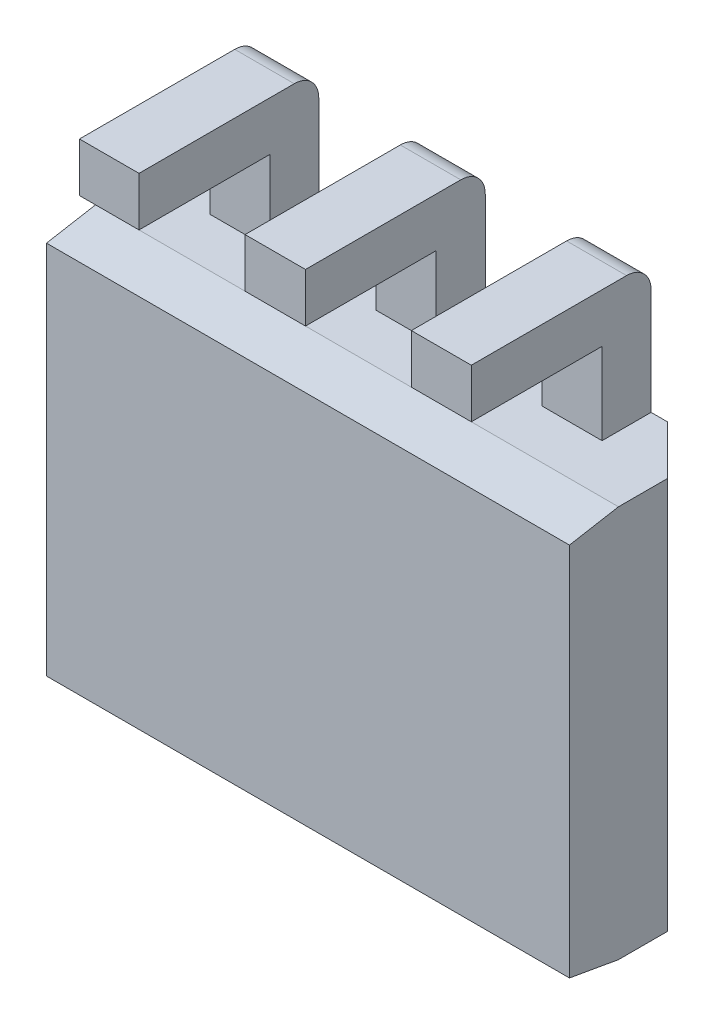
ISO-10303-21;
HEADER;
FILE_DESCRIPTION(('STEP AP214'),'2;1');
FILE_NAME('part.step','',(''),(''),'','','');
FILE_SCHEMA(('AUTOMOTIVE_DESIGN { 1 0 10303 214 1 1 1 1 }'));
ENDSEC;
DATA;
#1=APPLICATION_CONTEXT('core data for automotive mechanical design processes');
#2=APPLICATION_PROTOCOL_DEFINITION('international standard','automotive_design',2000,#1);
#3=PRODUCT_CONTEXT('',#1,'mechanical');
#4=PRODUCT('Part','Part','',(#3));
#5=PRODUCT_RELATED_PRODUCT_CATEGORY('part','',(#4));
#6=PRODUCT_DEFINITION_FORMATION('','',#4);
#7=PRODUCT_DEFINITION_CONTEXT('part definition',#1,'design');
#8=PRODUCT_DEFINITION('design','',#6,#7);
#9=PRODUCT_DEFINITION_SHAPE('','',#8);
#10=(LENGTH_UNIT() NAMED_UNIT(*) SI_UNIT(.MILLI.,.METRE.));
#11=(NAMED_UNIT(*) PLANE_ANGLE_UNIT() SI_UNIT($,.RADIAN.));
#12=(NAMED_UNIT(*) SI_UNIT($,.STERADIAN.) SOLID_ANGLE_UNIT());
#13=UNCERTAINTY_MEASURE_WITH_UNIT(LENGTH_MEASURE(1.E-05),#10,'distance_accuracy_value','');
#14=(GEOMETRIC_REPRESENTATION_CONTEXT(3) GLOBAL_UNCERTAINTY_ASSIGNED_CONTEXT((#13)) GLOBAL_UNIT_ASSIGNED_CONTEXT((#10,
#11,#12)) REPRESENTATION_CONTEXT('',''));
#15=CARTESIAN_POINT('',(0.,0.,0.));
#16=DIRECTION('',(0.,0.,1.));
#17=DIRECTION('',(1.,0.,0.));
#18=AXIS2_PLACEMENT_3D('',#15,#16,#17);
#19=CARTESIAN_POINT('',(-1.0423494314685,2.5,0.));
#20=DIRECTION('',(-1.,0.,0.));
#21=DIRECTION('',(0.,0.,1.));
#22=AXIS2_PLACEMENT_3D('',#19,#20,#21);
#23=PLANE('',#22);
#24=CARTESIAN_POINT('',(-1.0423494314685,2.3125,0.5625));
#25=DIRECTION('',(-1.,0.,0.));
#26=DIRECTION('',(0.,0.,1.));
#27=AXIS2_PLACEMENT_3D('',#24,#25,#26);
#28=CIRCLE('',#27,0.1875);
#29=CARTESIAN_POINT('',(-1.0423494314685,2.5,0.5625));
#30=VERTEX_POINT('',#29);
#31=CARTESIAN_POINT('',(-1.0423494314685,2.3125,0.375));
#32=VERTEX_POINT('',#31);
#33=EDGE_CURVE('E575',#30,#32,#28,.T.);
#34=ORIENTED_EDGE('',*,*,#33,.F.);
#35=DIRECTION('',(0.,0.,-1.));
#36=VECTOR('',#35,1.);
#37=CARTESIAN_POINT('',(-1.0423494314685,2.5,0.));
#38=LINE('',#37,#36);
#39=CARTESIAN_POINT('',(-1.0423494314685,2.5,1.75));
#40=VERTEX_POINT('',#39);
#41=EDGE_CURVE('E300',#40,#30,#38,.T.);
#42=ORIENTED_EDGE('',*,*,#41,.F.);
#43=DIRECTION('',(0.,1.,0.));
#44=VECTOR('',#43,1.);
#45=CARTESIAN_POINT('',(-1.0423494314685,2.5,1.75));
#46=LINE('',#45,#44);
#47=CARTESIAN_POINT('',(-1.0423494314685,2.125,1.75));
#48=VERTEX_POINT('',#47);
#49=EDGE_CURVE('E569',#48,#40,#46,.T.);
#50=ORIENTED_EDGE('',*,*,#49,.F.);
#51=DIRECTION('',(0.,0.,-1.));
#52=VECTOR('',#51,1.);
#53=CARTESIAN_POINT('',(-1.0423494314685,2.125,1.75));
#54=LINE('',#53,#52);
#55=CARTESIAN_POINT('',(-1.0423494314685,2.125,0.75));
#56=VERTEX_POINT('',#55);
#57=EDGE_CURVE('E567',#48,#56,#54,.T.);
#58=ORIENTED_EDGE('',*,*,#57,.T.);
#59=DIRECTION('',(0.,-1.,0.));
#60=VECTOR('',#59,1.);
#61=CARTESIAN_POINT('',(-1.0423494314685,2.5,0.75));
#62=LINE('',#61,#60);
#63=CARTESIAN_POINT('',(-1.0423494314685,1.5,0.75));
#64=VERTEX_POINT('',#63);
#65=EDGE_CURVE('E469',#56,#64,#62,.T.);
#66=ORIENTED_EDGE('',*,*,#65,.T.);
#67=DIRECTION('',(0.,0.,-1.));
#68=VECTOR('',#67,1.);
#69=CARTESIAN_POINT('',(-1.0423494314685,1.5,0.));
#70=LINE('',#69,#68);
#71=CARTESIAN_POINT('',(-1.0423494314685,1.5,0.375));
#72=VERTEX_POINT('',#71);
#73=EDGE_CURVE('E310',#64,#72,#70,.T.);
#74=ORIENTED_EDGE('',*,*,#73,.T.);
#75=DIRECTION('',(0.,-1.,0.));
#76=VECTOR('',#75,1.);
#77=CARTESIAN_POINT('',(-1.0423494314685,2.5,0.375));
#78=LINE('',#77,#76);
#79=EDGE_CURVE('E37',#32,#72,#78,.T.);
#80=ORIENTED_EDGE('',*,*,#79,.F.);
#81=EDGE_LOOP('',(#34,#42,#50,#58,#66,#74,#80));
#82=FACE_BOUND('',#81,.T.);
#83=ADVANCED_FACE('F33',(#82),#23,.F.);
#84=CARTESIAN_POINT('',(-1.49765056853151,2.5,0.));
#85=DIRECTION('',(-1.,0.,0.));
#86=DIRECTION('',(0.,0.,1.));
#87=AXIS2_PLACEMENT_3D('',#84,#85,#86);
#88=PLANE('',#87);
#89=DIRECTION('',(0.,0.,-1.));
#90=VECTOR('',#89,1.);
#91=CARTESIAN_POINT('',(-1.49765056853151,2.5,0.));
#92=LINE('',#91,#90);
#93=CARTESIAN_POINT('',(-1.49765056853151,2.5,1.75));
#94=VERTEX_POINT('',#93);
#95=CARTESIAN_POINT('',(-1.49765056853151,2.5,0.5625));
#96=VERTEX_POINT('',#95);
#97=EDGE_CURVE('E303',#94,#96,#92,.T.);
#98=ORIENTED_EDGE('',*,*,#97,.T.);
#99=CARTESIAN_POINT('',(-1.49765056853151,2.3125,0.5625));
#100=DIRECTION('',(-1.,0.,0.));
#101=DIRECTION('',(0.,0.,1.));
#102=AXIS2_PLACEMENT_3D('',#99,#100,#101);
#103=CIRCLE('',#102,0.1875);
#104=CARTESIAN_POINT('',(-1.49765056853151,2.3125,0.375));
#105=VERTEX_POINT('',#104);
#106=EDGE_CURVE('E51',#96,#105,#103,.T.);
#107=ORIENTED_EDGE('',*,*,#106,.T.);
#108=DIRECTION('',(0.,-1.,0.));
#109=VECTOR('',#108,1.);
#110=CARTESIAN_POINT('',(-1.49765056853151,2.5,0.375));
#111=LINE('',#110,#109);
#112=CARTESIAN_POINT('',(-1.49765056853151,1.5,0.375));
#113=VERTEX_POINT('',#112);
#114=EDGE_CURVE('E335',#105,#113,#111,.T.);
#115=ORIENTED_EDGE('',*,*,#114,.T.);
#116=DIRECTION('',(0.,0.,-1.));
#117=VECTOR('',#116,1.);
#118=CARTESIAN_POINT('',(-1.49765056853151,1.5,0.));
#119=LINE('',#118,#117);
#120=CARTESIAN_POINT('',(-1.49765056853151,1.5,0.75));
#121=VERTEX_POINT('',#120);
#122=EDGE_CURVE('E304',#121,#113,#119,.T.);
#123=ORIENTED_EDGE('',*,*,#122,.F.);
#124=DIRECTION('',(0.,-1.,0.));
#125=VECTOR('',#124,1.);
#126=CARTESIAN_POINT('',(-1.49765056853151,2.5,0.75));
#127=LINE('',#126,#125);
#128=CARTESIAN_POINT('',(-1.49765056853151,2.125,0.75));
#129=VERTEX_POINT('',#128);
#130=EDGE_CURVE('E307',#129,#121,#127,.T.);
#131=ORIENTED_EDGE('',*,*,#130,.F.);
#132=DIRECTION('',(0.,0.,-1.));
#133=VECTOR('',#132,1.);
#134=CARTESIAN_POINT('',(-1.49765056853151,2.125,1.75));
#135=LINE('',#134,#133);
#136=CARTESIAN_POINT('',(-1.49765056853151,2.125,1.75));
#137=VERTEX_POINT('',#136);
#138=EDGE_CURVE('E561',#137,#129,#135,.T.);
#139=ORIENTED_EDGE('',*,*,#138,.F.);
#140=DIRECTION('',(0.,-1.,0.));
#141=VECTOR('',#140,1.);
#142=CARTESIAN_POINT('',(-1.49765056853151,2.5,1.75));
#143=LINE('',#142,#141);
#144=EDGE_CURVE('E559',#94,#137,#143,.T.);
#145=ORIENTED_EDGE('',*,*,#144,.F.);
#146=EDGE_LOOP('',(#98,#107,#115,#123,#131,#139,#145));
#147=FACE_BOUND('',#146,.T.);
#148=ADVANCED_FACE('F491',(#147),#88,.T.);
#149=CARTESIAN_POINT('',(0.231039418599735,2.5,0.));
#150=DIRECTION('',(-1.,0.,0.));
#151=DIRECTION('',(0.,0.,1.));
#152=AXIS2_PLACEMENT_3D('',#149,#150,#151);
#153=PLANE('',#152);
#154=CARTESIAN_POINT('',(0.231039418599735,2.3125,0.5625));
#155=DIRECTION('',(-1.,0.,0.));
#156=DIRECTION('',(0.,0.,1.));
#157=AXIS2_PLACEMENT_3D('',#154,#155,#156);
#158=CIRCLE('',#157,0.1875);
#159=CARTESIAN_POINT('',(0.231039418599735,2.5,0.5625));
#160=VERTEX_POINT('',#159);
#161=CARTESIAN_POINT('',(0.231039418599735,2.3125,0.375));
#162=VERTEX_POINT('',#161);
#163=EDGE_CURVE('E652',#160,#162,#158,.T.);
#164=ORIENTED_EDGE('',*,*,#163,.F.);
#165=DIRECTION('',(0.,0.,-1.));
#166=VECTOR('',#165,1.);
#167=CARTESIAN_POINT('',(0.231039418599735,2.5,0.));
#168=LINE('',#167,#166);
#169=CARTESIAN_POINT('',(0.231039418599735,2.5,1.75));
#170=VERTEX_POINT('',#169);
#171=EDGE_CURVE('E274',#170,#160,#168,.T.);
#172=ORIENTED_EDGE('',*,*,#171,.F.);
#173=DIRECTION('',(0.,1.,0.));
#174=VECTOR('',#173,1.);
#175=CARTESIAN_POINT('',(0.231039418599735,2.5,1.75));
#176=LINE('',#175,#174);
#177=CARTESIAN_POINT('',(0.231039418599735,2.125,1.75));
#178=VERTEX_POINT('',#177);
#179=EDGE_CURVE('E596',#178,#170,#176,.T.);
#180=ORIENTED_EDGE('',*,*,#179,.F.);
#181=DIRECTION('',(0.,0.,-1.));
#182=VECTOR('',#181,1.);
#183=CARTESIAN_POINT('',(0.231039418599735,2.125,1.75));
#184=LINE('',#183,#182);
#185=CARTESIAN_POINT('',(0.231039418599735,2.125,0.75));
#186=VERTEX_POINT('',#185);
#187=EDGE_CURVE('E606',#178,#186,#184,.T.);
#188=ORIENTED_EDGE('',*,*,#187,.T.);
#189=DIRECTION('',(0.,-1.,0.));
#190=VECTOR('',#189,1.);
#191=CARTESIAN_POINT('',(0.231039418599735,2.5,0.75));
#192=LINE('',#191,#190);
#193=CARTESIAN_POINT('',(0.231039418599735,1.5,0.75));
#194=VERTEX_POINT('',#193);
#195=EDGE_CURVE('E297',#186,#194,#192,.T.);
#196=ORIENTED_EDGE('',*,*,#195,.T.);
#197=DIRECTION('',(0.,0.,-1.));
#198=VECTOR('',#197,1.);
#199=CARTESIAN_POINT('',(0.231039418599735,1.5,0.));
#200=LINE('',#199,#198);
#201=CARTESIAN_POINT('',(0.231039418599735,1.5,0.375));
#202=VERTEX_POINT('',#201);
#203=EDGE_CURVE('E284',#194,#202,#200,.T.);
#204=ORIENTED_EDGE('',*,*,#203,.T.);
#205=DIRECTION('',(0.,-1.,0.));
#206=VECTOR('',#205,1.);
#207=CARTESIAN_POINT('',(0.231039418599735,2.5,0.375));
#208=LINE('',#207,#206);
#209=EDGE_CURVE('E295',#162,#202,#208,.T.);
#210=ORIENTED_EDGE('',*,*,#209,.F.);
#211=EDGE_LOOP('',(#164,#172,#180,#188,#196,#204,#210));
#212=FACE_BOUND('',#211,.T.);
#213=ADVANCED_FACE('F496',(#212),#153,.F.);
#214=CARTESIAN_POINT('',(-0.231039418599738,2.5,0.));
#215=DIRECTION('',(-1.,0.,0.));
#216=DIRECTION('',(0.,0.,1.));
#217=AXIS2_PLACEMENT_3D('',#214,#215,#216);
#218=PLANE('',#217);
#219=DIRECTION('',(0.,0.,-1.));
#220=VECTOR('',#219,1.);
#221=CARTESIAN_POINT('',(-0.231039418599738,2.5,0.));
#222=LINE('',#221,#220);
#223=CARTESIAN_POINT('',(-0.231039418599738,2.5,1.75));
#224=VERTEX_POINT('',#223);
#225=CARTESIAN_POINT('',(-0.231039418599738,2.5,0.5625));
#226=VERTEX_POINT('',#225);
#227=EDGE_CURVE('E277',#224,#226,#222,.T.);
#228=ORIENTED_EDGE('',*,*,#227,.T.);
#229=CARTESIAN_POINT('',(-0.231039418599738,2.3125,0.5625));
#230=DIRECTION('',(-1.,0.,0.));
#231=DIRECTION('',(0.,0.,1.));
#232=AXIS2_PLACEMENT_3D('',#229,#230,#231);
#233=CIRCLE('',#232,0.1875);
#234=CARTESIAN_POINT('',(-0.231039418599738,2.3125,0.375));
#235=VERTEX_POINT('',#234);
#236=EDGE_CURVE('E59',#226,#235,#233,.T.);
#237=ORIENTED_EDGE('',*,*,#236,.T.);
#238=DIRECTION('',(0.,-1.,0.));
#239=VECTOR('',#238,1.);
#240=CARTESIAN_POINT('',(-0.231039418599738,2.5,0.375));
#241=LINE('',#240,#239);
#242=CARTESIAN_POINT('',(-0.231039418599738,1.5,0.375));
#243=VERTEX_POINT('',#242);
#244=EDGE_CURVE('E293',#235,#243,#241,.T.);
#245=ORIENTED_EDGE('',*,*,#244,.T.);
#246=DIRECTION('',(0.,0.,-1.));
#247=VECTOR('',#246,1.);
#248=CARTESIAN_POINT('',(-0.231039418599738,1.5,0.));
#249=LINE('',#248,#247);
#250=CARTESIAN_POINT('',(-0.231039418599738,1.5,0.75));
#251=VERTEX_POINT('',#250);
#252=EDGE_CURVE('E278',#251,#243,#249,.T.);
#253=ORIENTED_EDGE('',*,*,#252,.F.);
#254=DIRECTION('',(0.,-1.,0.));
#255=VECTOR('',#254,1.);
#256=CARTESIAN_POINT('',(-0.231039418599738,2.5,0.75));
#257=LINE('',#256,#255);
#258=CARTESIAN_POINT('',(-0.231039418599738,2.125,0.75));
#259=VERTEX_POINT('',#258);
#260=EDGE_CURVE('E281',#259,#251,#257,.T.);
#261=ORIENTED_EDGE('',*,*,#260,.F.);
#262=DIRECTION('',(0.,0.,-1.));
#263=VECTOR('',#262,1.);
#264=CARTESIAN_POINT('',(-0.231039418599738,2.125,1.75));
#265=LINE('',#264,#263);
#266=CARTESIAN_POINT('',(-0.231039418599738,2.125,1.75));
#267=VERTEX_POINT('',#266);
#268=EDGE_CURVE('E610',#267,#259,#265,.T.);
#269=ORIENTED_EDGE('',*,*,#268,.F.);
#270=DIRECTION('',(0.,-1.,0.));
#271=VECTOR('',#270,1.);
#272=CARTESIAN_POINT('',(-0.231039418599738,2.5,1.75));
#273=LINE('',#272,#271);
#274=EDGE_CURVE('E602',#224,#267,#273,.T.);
#275=ORIENTED_EDGE('',*,*,#274,.F.);
#276=EDGE_LOOP('',(#228,#237,#245,#253,#261,#269,#275));
#277=FACE_BOUND('',#276,.T.);
#278=ADVANCED_FACE('F631',(#277),#218,.T.);
#279=CARTESIAN_POINT('',(1.04060488884218,2.5,0.));
#280=DIRECTION('',(1.,0.,0.));
#281=DIRECTION('',(0.,0.,-1.));
#282=AXIS2_PLACEMENT_3D('',#279,#280,#281);
#283=PLANE('',#282);
#284=CARTESIAN_POINT('',(1.04060488884218,2.3125,0.5625));
#285=DIRECTION('',(1.,0.,0.));
#286=DIRECTION('',(0.,0.,-1.));
#287=AXIS2_PLACEMENT_3D('',#284,#285,#286);
#288=CIRCLE('',#287,0.1875);
#289=CARTESIAN_POINT('',(1.04060488884218,2.3125,0.375));
#290=VERTEX_POINT('',#289);
#291=CARTESIAN_POINT('',(1.04060488884218,2.5,0.5625));
#292=VERTEX_POINT('',#291);
#293=EDGE_CURVE('E554',#290,#292,#288,.T.);
#294=ORIENTED_EDGE('',*,*,#293,.F.);
#295=DIRECTION('',(0.,-1.,0.));
#296=VECTOR('',#295,1.);
#297=CARTESIAN_POINT('',(1.04060488884218,2.5,0.375));
#298=LINE('',#297,#296);
#299=CARTESIAN_POINT('',(1.04060488884218,1.5,0.375));
#300=VERTEX_POINT('',#299);
#301=EDGE_CURVE('E253',#290,#300,#298,.T.);
#302=ORIENTED_EDGE('',*,*,#301,.T.);
#303=DIRECTION('',(0.,0.,1.));
#304=VECTOR('',#303,1.);
#305=CARTESIAN_POINT('',(1.04060488884218,1.5,0.));
#306=LINE('',#305,#304);
#307=CARTESIAN_POINT('',(1.04060488884218,1.5,0.75));
#308=VERTEX_POINT('',#307);
#309=EDGE_CURVE('E615',#300,#308,#306,.T.);
#310=ORIENTED_EDGE('',*,*,#309,.T.);
#311=DIRECTION('',(0.,-1.,0.));
#312=VECTOR('',#311,1.);
#313=CARTESIAN_POINT('',(1.04060488884218,2.5,0.75));
#314=LINE('',#313,#312);
#315=CARTESIAN_POINT('',(1.04060488884218,2.125,0.75));
#316=VERTEX_POINT('',#315);
#317=EDGE_CURVE('E264',#316,#308,#314,.T.);
#318=ORIENTED_EDGE('',*,*,#317,.F.);
#319=DIRECTION('',(0.,0.,-1.));
#320=VECTOR('',#319,1.);
#321=CARTESIAN_POINT('',(1.04060488884218,2.125,1.75));
#322=LINE('',#321,#320);
#323=CARTESIAN_POINT('',(1.04060488884218,2.125,1.75));
#324=VERTEX_POINT('',#323);
#325=EDGE_CURVE('E593',#324,#316,#322,.T.);
#326=ORIENTED_EDGE('',*,*,#325,.F.);
#327=DIRECTION('',(0.,-1.,0.));
#328=VECTOR('',#327,1.);
#329=CARTESIAN_POINT('',(1.04060488884218,2.5,1.75));
#330=LINE('',#329,#328);
#331=CARTESIAN_POINT('',(1.04060488884218,2.5,1.75));
#332=VERTEX_POINT('',#331);
#333=EDGE_CURVE('E585',#332,#324,#330,.T.);
#334=ORIENTED_EDGE('',*,*,#333,.F.);
#335=DIRECTION('',(0.,0.,1.));
#336=VECTOR('',#335,1.);
#337=CARTESIAN_POINT('',(1.04060488884218,2.5,0.));
#338=LINE('',#337,#336);
#339=EDGE_CURVE('E266',#292,#332,#338,.T.);
#340=ORIENTED_EDGE('',*,*,#339,.F.);
#341=EDGE_LOOP('',(#294,#302,#310,#318,#326,#334,#340));
#342=FACE_BOUND('',#341,.T.);
#343=ADVANCED_FACE('F695',(#342),#283,.F.);
#344=CARTESIAN_POINT('',(1.49939511115781,2.5,0.));
#345=DIRECTION('',(1.,0.,0.));
#346=DIRECTION('',(0.,0.,-1.));
#347=AXIS2_PLACEMENT_3D('',#344,#345,#346);
#348=PLANE('',#347);
#349=DIRECTION('',(0.,-1.,0.));
#350=VECTOR('',#349,1.);
#351=CARTESIAN_POINT('',(1.49939511115781,2.5,0.375));
#352=LINE('',#351,#350);
#353=CARTESIAN_POINT('',(1.49939511115781,2.3125,0.375));
#354=VERTEX_POINT('',#353);
#355=CARTESIAN_POINT('',(1.49939511115781,1.5,0.375));
#356=VERTEX_POINT('',#355);
#357=EDGE_CURVE('E251',#354,#356,#352,.T.);
#358=ORIENTED_EDGE('',*,*,#357,.F.);
#359=CARTESIAN_POINT('',(1.49939511115781,2.3125,0.5625));
#360=DIRECTION('',(1.,0.,0.));
#361=DIRECTION('',(0.,0.,-1.));
#362=AXIS2_PLACEMENT_3D('',#359,#360,#361);
#363=CIRCLE('',#362,0.1875);
#364=CARTESIAN_POINT('',(1.49939511115781,2.5,0.5625));
#365=VERTEX_POINT('',#364);
#366=EDGE_CURVE('E237',#354,#365,#363,.T.);
#367=ORIENTED_EDGE('',*,*,#366,.T.);
#368=DIRECTION('',(0.,0.,1.));
#369=VECTOR('',#368,1.);
#370=CARTESIAN_POINT('',(1.49939511115781,2.5,0.));
#371=LINE('',#370,#369);
#372=CARTESIAN_POINT('',(1.49939511115781,2.5,1.75));
#373=VERTEX_POINT('',#372);
#374=EDGE_CURVE('E262',#365,#373,#371,.T.);
#375=ORIENTED_EDGE('',*,*,#374,.T.);
#376=DIRECTION('',(0.,1.,0.));
#377=VECTOR('',#376,1.);
#378=CARTESIAN_POINT('',(1.49939511115781,2.5,1.75));
#379=LINE('',#378,#377);
#380=CARTESIAN_POINT('',(1.49939511115781,2.125,1.75));
#381=VERTEX_POINT('',#380);
#382=EDGE_CURVE('E579',#381,#373,#379,.T.);
#383=ORIENTED_EDGE('',*,*,#382,.F.);
#384=DIRECTION('',(0.,0.,-1.));
#385=VECTOR('',#384,1.);
#386=CARTESIAN_POINT('',(1.49939511115781,2.125,1.75));
#387=LINE('',#386,#385);
#388=CARTESIAN_POINT('',(1.49939511115781,2.125,0.75));
#389=VERTEX_POINT('',#388);
#390=EDGE_CURVE('E589',#381,#389,#387,.T.);
#391=ORIENTED_EDGE('',*,*,#390,.T.);
#392=DIRECTION('',(0.,-1.,0.));
#393=VECTOR('',#392,1.);
#394=CARTESIAN_POINT('',(1.49939511115781,2.5,0.75));
#395=LINE('',#394,#393);
#396=CARTESIAN_POINT('',(1.49939511115781,1.5,0.75));
#397=VERTEX_POINT('',#396);
#398=EDGE_CURVE('E261',#389,#397,#395,.T.);
#399=ORIENTED_EDGE('',*,*,#398,.T.);
#400=DIRECTION('',(0.,0.,1.));
#401=VECTOR('',#400,1.);
#402=CARTESIAN_POINT('',(1.49939511115781,1.5,0.));
#403=LINE('',#402,#401);
#404=EDGE_CURVE('E259',#356,#397,#403,.T.);
#405=ORIENTED_EDGE('',*,*,#404,.F.);
#406=EDGE_LOOP('',(#358,#367,#375,#383,#391,#399,#405));
#407=FACE_BOUND('',#406,.T.);
#408=ADVANCED_FACE('F257',(#407),#348,.T.);
#409=CARTESIAN_POINT('',(0.,2.5,0.75));
#410=DIRECTION('',(0.,0.,-1.));
#411=DIRECTION('',(-1.,0.,0.));
#412=AXIS2_PLACEMENT_3D('',#409,#410,#411);
#413=PLANE('',#412);
#414=DIRECTION('',(1.,0.,0.));
#415=VECTOR('',#414,1.);
#416=CARTESIAN_POINT('',(-1.0423494314685,2.125,0.75));
#417=LINE('',#416,#415);
#418=EDGE_CURVE('E573',#129,#56,#417,.T.);
#419=ORIENTED_EDGE('',*,*,#418,.F.);
#420=ORIENTED_EDGE('',*,*,#130,.T.);
#421=DIRECTION('',(1.,0.,0.));
#422=VECTOR('',#421,1.);
#423=CARTESIAN_POINT('',(0.,1.5,0.75));
#424=LINE('',#423,#422);
#425=EDGE_CURVE('E299',#121,#64,#424,.T.);
#426=ORIENTED_EDGE('',*,*,#425,.T.);
#427=ORIENTED_EDGE('',*,*,#65,.F.);
#428=EDGE_LOOP('',(#419,#420,#426,#427));
#429=FACE_BOUND('',#428,.T.);
#430=ADVANCED_FACE('F501',(#429),#413,.F.);
#431=CARTESIAN_POINT('',(0.,2.5,0.75));
#432=DIRECTION('',(0.,0.,-1.));
#433=DIRECTION('',(-1.,0.,0.));
#434=AXIS2_PLACEMENT_3D('',#431,#432,#433);
#435=PLANE('',#434);
#436=DIRECTION('',(1.,0.,0.));
#437=VECTOR('',#436,1.);
#438=CARTESIAN_POINT('',(1.49939511115781,2.125,0.75));
#439=LINE('',#438,#437);
#440=EDGE_CURVE('E578',#316,#389,#439,.T.);
#441=ORIENTED_EDGE('',*,*,#440,.F.);
#442=ORIENTED_EDGE('',*,*,#317,.T.);
#443=DIRECTION('',(1.,0.,0.));
#444=VECTOR('',#443,1.);
#445=CARTESIAN_POINT('',(0.,1.5,0.75));
#446=LINE('',#445,#444);
#447=EDGE_CURVE('E617',#308,#397,#446,.T.);
#448=ORIENTED_EDGE('',*,*,#447,.T.);
#449=ORIENTED_EDGE('',*,*,#398,.F.);
#450=EDGE_LOOP('',(#441,#442,#448,#449));
#451=FACE_BOUND('',#450,.T.);
#452=ADVANCED_FACE('F504',(#451),#435,.F.);
#453=CARTESIAN_POINT('',(0.,2.5,0.75));
#454=DIRECTION('',(0.,0.,-1.));
#455=DIRECTION('',(-1.,0.,0.));
#456=AXIS2_PLACEMENT_3D('',#453,#454,#455);
#457=PLANE('',#456);
#458=DIRECTION('',(1.,0.,0.));
#459=VECTOR('',#458,1.);
#460=CARTESIAN_POINT('',(0.231039418599735,2.125,0.75));
#461=LINE('',#460,#459);
#462=EDGE_CURVE('E595',#259,#186,#461,.T.);
#463=ORIENTED_EDGE('',*,*,#462,.F.);
#464=ORIENTED_EDGE('',*,*,#260,.T.);
#465=DIRECTION('',(1.,0.,0.));
#466=VECTOR('',#465,1.);
#467=CARTESIAN_POINT('',(0.,1.5,0.75));
#468=LINE('',#467,#466);
#469=EDGE_CURVE('E273',#251,#194,#468,.T.);
#470=ORIENTED_EDGE('',*,*,#469,.T.);
#471=ORIENTED_EDGE('',*,*,#195,.F.);
#472=EDGE_LOOP('',(#463,#464,#470,#471));
#473=FACE_BOUND('',#472,.T.);
#474=ADVANCED_FACE('F526',(#473),#457,.F.);
#475=CARTESIAN_POINT('',(-2.,1.5,1.5));
#476=DIRECTION('',(0.,-1.,0.));
#477=DIRECTION('',(0.,0.,-1.));
#478=AXIS2_PLACEMENT_3D('',#475,#476,#477);
#479=PLANE('',#478);
#480=ORIENTED_EDGE('',*,*,#309,.F.);
#481=DIRECTION('',(1.,0.,0.));
#482=VECTOR('',#481,1.);
#483=CARTESIAN_POINT('',(-2.,1.5,0.375));
#484=LINE('',#483,#482);
#485=EDGE_CURVE('E333',#202,#300,#484,.T.);
#486=ORIENTED_EDGE('',*,*,#485,.F.);
#487=ORIENTED_EDGE('',*,*,#203,.F.);
#488=ORIENTED_EDGE('',*,*,#469,.F.);
#489=ORIENTED_EDGE('',*,*,#252,.T.);
#490=EDGE_CURVE('E318',#72,#243,#484,.T.);
#491=ORIENTED_EDGE('',*,*,#490,.F.);
#492=ORIENTED_EDGE('',*,*,#73,.F.);
#493=ORIENTED_EDGE('',*,*,#425,.F.);
#494=ORIENTED_EDGE('',*,*,#122,.T.);
#495=CARTESIAN_POINT('',(-1.625,1.5,0.375));
#496=VERTEX_POINT('',#495);
#497=EDGE_CURVE('E348',#496,#113,#484,.T.);
#498=ORIENTED_EDGE('',*,*,#497,.F.);
#499=DIRECTION('',(0.707106781186546,0.,-0.707106781186549));
#500=VECTOR('',#499,1.);
#501=CARTESIAN_POINT('',(-0.625000000000005,1.5,-0.625000000000002));
#502=LINE('',#501,#500);
#503=CARTESIAN_POINT('',(-2.,1.5,0.75));
#504=VERTEX_POINT('',#503);
#505=EDGE_CURVE('E375',#504,#496,#502,.T.);
#506=ORIENTED_EDGE('',*,*,#505,.F.);
#507=DIRECTION('',(0.,0.,-1.));
#508=VECTOR('',#507,1.);
#509=CARTESIAN_POINT('',(-2.,1.5,1.5));
#510=LINE('',#509,#508);
#511=CARTESIAN_POINT('',(-2.,1.5,1.125));
#512=VERTEX_POINT('',#511);
#513=EDGE_CURVE('E356',#512,#504,#510,.T.);
#514=ORIENTED_EDGE('',*,*,#513,.F.);
#515=DIRECTION('',(1.,0.,0.));
#516=VECTOR('',#515,1.);
#517=CARTESIAN_POINT('',(-2.,1.5,1.125));
#518=LINE('',#517,#516);
#519=CARTESIAN_POINT('',(2.,1.5,1.125));
#520=VERTEX_POINT('',#519);
#521=EDGE_CURVE('E433',#512,#520,#518,.T.);
#522=ORIENTED_EDGE('',*,*,#521,.T.);
#523=DIRECTION('',(0.,0.,-1.));
#524=VECTOR('',#523,1.);
#525=CARTESIAN_POINT('',(2.,1.5,1.5));
#526=LINE('',#525,#524);
#527=CARTESIAN_POINT('',(2.,1.5,0.75));
#528=VERTEX_POINT('',#527);
#529=EDGE_CURVE('E362',#520,#528,#526,.T.);
#530=ORIENTED_EDGE('',*,*,#529,.T.);
#531=DIRECTION('',(-0.707106781186551,0.,-0.707106781186544));
#532=VECTOR('',#531,1.);
#533=CARTESIAN_POINT('',(0.624999999999989,1.5,-0.624999999999996));
#534=LINE('',#533,#532);
#535=CARTESIAN_POINT('',(1.625,1.5,0.375000000000001));
#536=VERTEX_POINT('',#535);
#537=EDGE_CURVE('E386',#528,#536,#534,.T.);
#538=ORIENTED_EDGE('',*,*,#537,.T.);
#539=EDGE_CURVE('E336',#356,#536,#484,.T.);
#540=ORIENTED_EDGE('',*,*,#539,.F.);
#541=ORIENTED_EDGE('',*,*,#404,.T.);
#542=ORIENTED_EDGE('',*,*,#447,.F.);
#543=EDGE_LOOP('',(#480,#486,#487,#488,#489,#491,#492,#493,#494,#498,#506,#514,#522,#530,#538,
#540,#541,#542));
#544=FACE_BOUND('',#543,.T.);
#545=ADVANCED_FACE('F35',(#544),#479,.F.);
#546=CARTESIAN_POINT('',(2.,1.5,1.5));
#547=DIRECTION('',(-1.,0.,0.));
#548=DIRECTION('',(0.,0.,1.));
#549=AXIS2_PLACEMENT_3D('',#546,#547,#548);
#550=PLANE('',#549);
#551=DIRECTION('',(0.,-0.173648177666924,0.984807753012209));
#552=VECTOR('',#551,1.);
#553=CARTESIAN_POINT('',(2.,1.64715579621012,0.290438008302167));
#554=LINE('',#553,#552);
#555=CARTESIAN_POINT('',(2.,1.43387738223433,1.5));
#556=VERTEX_POINT('',#555);
#557=EDGE_CURVE('E438',#520,#556,#554,.T.);
#558=ORIENTED_EDGE('',*,*,#557,.T.);
#559=DIRECTION('',(0.,1.,0.));
#560=VECTOR('',#559,1.);
#561=CARTESIAN_POINT('',(2.,1.5,1.5));
#562=LINE('',#561,#560);
#563=CARTESIAN_POINT('',(2.,-1.43387738223432,1.5));
#564=VERTEX_POINT('',#563);
#565=EDGE_CURVE('E364',#564,#556,#562,.T.);
#566=ORIENTED_EDGE('',*,*,#565,.F.);
#567=DIRECTION('',(0.,0.173648177666931,0.984807753012208));
#568=VECTOR('',#567,1.);
#569=CARTESIAN_POINT('',(2.,-1.64715579621012,0.290438008302179));
#570=LINE('',#569,#568);
#571=CARTESIAN_POINT('',(2.,-1.5,1.12499999999999));
#572=VERTEX_POINT('',#571);
#573=EDGE_CURVE('E440',#572,#564,#570,.T.);
#574=ORIENTED_EDGE('',*,*,#573,.F.);
#575=DIRECTION('',(0.,0.,-1.));
#576=VECTOR('',#575,1.);
#577=CARTESIAN_POINT('',(2.,-1.5,1.5));
#578=LINE('',#577,#576);
#579=CARTESIAN_POINT('',(2.,-1.5,0.75));
#580=VERTEX_POINT('',#579);
#581=EDGE_CURVE('E360',#572,#580,#578,.T.);
#582=ORIENTED_EDGE('',*,*,#581,.T.);
#583=DIRECTION('',(0.,1.,0.));
#584=VECTOR('',#583,1.);
#585=CARTESIAN_POINT('',(2.,-1.5,0.75));
#586=LINE('',#585,#584);
#587=EDGE_CURVE('E381',#580,#528,#586,.T.);
#588=ORIENTED_EDGE('',*,*,#587,.T.);
#589=ORIENTED_EDGE('',*,*,#529,.F.);
#590=EDGE_LOOP('',(#558,#566,#574,#582,#588,#589));
#591=FACE_BOUND('',#590,.T.);
#592=ADVANCED_FACE('F436',(#591),#550,.F.);
#593=CARTESIAN_POINT('',(-2.,1.5,1.5));
#594=DIRECTION('',(1.,0.,0.));
#595=DIRECTION('',(0.,0.,-1.));
#596=AXIS2_PLACEMENT_3D('',#593,#594,#595);
#597=PLANE('',#596);
#598=DIRECTION('',(0.,-0.173648177666924,0.984807753012209));
#599=VECTOR('',#598,1.);
#600=CARTESIAN_POINT('',(-2.,1.64715579621012,0.290438008302167));
#601=LINE('',#600,#599);
#602=CARTESIAN_POINT('',(-2.,1.43387738223433,1.5));
#603=VERTEX_POINT('',#602);
#604=EDGE_CURVE('E473',#512,#603,#601,.T.);
#605=ORIENTED_EDGE('',*,*,#604,.F.);
#606=ORIENTED_EDGE('',*,*,#513,.T.);
#607=DIRECTION('',(0.,1.,0.));
#608=VECTOR('',#607,1.);
#609=CARTESIAN_POINT('',(-2.,-1.5,0.75));
#610=LINE('',#609,#608);
#611=CARTESIAN_POINT('',(-2.,-1.5,0.75));
#612=VERTEX_POINT('',#611);
#613=EDGE_CURVE('E370',#612,#504,#610,.T.);
#614=ORIENTED_EDGE('',*,*,#613,.F.);
#615=DIRECTION('',(0.,0.,-1.));
#616=VECTOR('',#615,1.);
#617=CARTESIAN_POINT('',(-2.,-1.5,1.5));
#618=LINE('',#617,#616);
#619=CARTESIAN_POINT('',(-2.,-1.5,1.12499999999999));
#620=VERTEX_POINT('',#619);
#621=EDGE_CURVE('E358',#620,#612,#618,.T.);
#622=ORIENTED_EDGE('',*,*,#621,.F.);
#623=DIRECTION('',(0.,0.173648177666931,0.984807753012208));
#624=VECTOR('',#623,1.);
#625=CARTESIAN_POINT('',(-2.,-1.64715579621012,0.290438008302179));
#626=LINE('',#625,#624);
#627=CARTESIAN_POINT('',(-2.,-1.43387738223432,1.5));
#628=VERTEX_POINT('',#627);
#629=EDGE_CURVE('E443',#620,#628,#626,.T.);
#630=ORIENTED_EDGE('',*,*,#629,.T.);
#631=DIRECTION('',(0.,-1.,0.));
#632=VECTOR('',#631,1.);
#633=CARTESIAN_POINT('',(-2.,1.5,1.5));
#634=LINE('',#633,#632);
#635=EDGE_CURVE('E367',#603,#628,#634,.T.);
#636=ORIENTED_EDGE('',*,*,#635,.F.);
#637=EDGE_LOOP('',(#605,#606,#614,#622,#630,#636));
#638=FACE_BOUND('',#637,.T.);
#639=ADVANCED_FACE('F455',(#638),#597,.F.);
#640=CARTESIAN_POINT('',(0.,0.,1.5));
#641=DIRECTION('',(0.,0.,-1.));
#642=DIRECTION('',(-1.,0.,0.));
#643=AXIS2_PLACEMENT_3D('',#640,#641,#642);
#644=PLANE('',#643);
#645=DIRECTION('',(1.,0.,0.));
#646=VECTOR('',#645,1.);
#647=CARTESIAN_POINT('',(-2.,1.43387738223433,1.5));
#648=LINE('',#647,#646);
#649=EDGE_CURVE('E444',#603,#556,#648,.T.);
#650=ORIENTED_EDGE('',*,*,#649,.F.);
#651=ORIENTED_EDGE('',*,*,#635,.T.);
#652=DIRECTION('',(1.,0.,0.));
#653=VECTOR('',#652,1.);
#654=CARTESIAN_POINT('',(-2.,-1.43387738223432,1.5));
#655=LINE('',#654,#653);
#656=EDGE_CURVE('E405',#628,#564,#655,.T.);
#657=ORIENTED_EDGE('',*,*,#656,.T.);
#658=ORIENTED_EDGE('',*,*,#565,.T.);
#659=EDGE_LOOP('',(#650,#651,#657,#658));
#660=FACE_BOUND('',#659,.T.);
#661=ADVANCED_FACE('F480',(#660),#644,.F.);
#662=CARTESIAN_POINT('',(-2.,-1.5,1.5));
#663=DIRECTION('',(0.,1.,0.));
#664=DIRECTION('',(0.,0.,1.));
#665=AXIS2_PLACEMENT_3D('',#662,#663,#664);
#666=PLANE('',#665);
#667=ORIENTED_EDGE('',*,*,#581,.F.);
#668=DIRECTION('',(1.,0.,0.));
#669=VECTOR('',#668,1.);
#670=CARTESIAN_POINT('',(-2.,-1.5,1.12499999999999));
#671=LINE('',#670,#669);
#672=EDGE_CURVE('E409',#620,#572,#671,.T.);
#673=ORIENTED_EDGE('',*,*,#672,.F.);
#674=ORIENTED_EDGE('',*,*,#621,.T.);
#675=DIRECTION('',(0.707106781186546,0.,-0.707106781186549));
#676=VECTOR('',#675,1.);
#677=CARTESIAN_POINT('',(-0.625000000000005,-1.5,-0.625000000000002));
#678=LINE('',#677,#676);
#679=CARTESIAN_POINT('',(-1.625,-1.5,0.375000000000002));
#680=VERTEX_POINT('',#679);
#681=EDGE_CURVE('E373',#612,#680,#678,.T.);
#682=ORIENTED_EDGE('',*,*,#681,.T.);
#683=DIRECTION('',(1.,0.,0.));
#684=VECTOR('',#683,1.);
#685=CARTESIAN_POINT('',(-2.,-1.5,0.375000000000002));
#686=LINE('',#685,#684);
#687=CARTESIAN_POINT('',(1.625,-1.5,0.375000000000002));
#688=VERTEX_POINT('',#687);
#689=EDGE_CURVE('E400',#680,#688,#686,.T.);
#690=ORIENTED_EDGE('',*,*,#689,.T.);
#691=DIRECTION('',(-0.707106781186551,0.,-0.707106781186544));
#692=VECTOR('',#691,1.);
#693=CARTESIAN_POINT('',(0.624999999999989,-1.5,-0.624999999999996));
#694=LINE('',#693,#692);
#695=EDGE_CURVE('E384',#580,#688,#694,.T.);
#696=ORIENTED_EDGE('',*,*,#695,.F.);
#697=EDGE_LOOP('',(#667,#673,#674,#682,#690,#696));
#698=FACE_BOUND('',#697,.T.);
#699=ADVANCED_FACE('F398',(#698),#666,.F.);
#700=CARTESIAN_POINT('',(0.,0.,0.));
#701=DIRECTION('',(0.,0.,-1.));
#702=DIRECTION('',(-1.,0.,0.));
#703=AXIS2_PLACEMENT_3D('',#700,#701,#702);
#704=PLANE('',#703);
#705=DIRECTION('',(0.,1.,0.));
#706=VECTOR('',#705,1.);
#707=CARTESIAN_POINT('',(1.24999999999999,-1.5,0.));
#708=LINE('',#707,#706);
#709=CARTESIAN_POINT('',(1.24999999999999,-1.43387738223433,0.));
#710=VERTEX_POINT('',#709);
#711=CARTESIAN_POINT('',(1.24999999999999,1.125,0.));
#712=VERTEX_POINT('',#711);
#713=EDGE_CURVE('E378',#710,#712,#708,.T.);
#714=ORIENTED_EDGE('',*,*,#713,.F.);
#715=DIRECTION('',(1.,0.,0.));
#716=VECTOR('',#715,1.);
#717=CARTESIAN_POINT('',(-2.,-1.43387738223433,0.));
#718=LINE('',#717,#716);
#719=CARTESIAN_POINT('',(-1.25,-1.43387738223433,0.));
#720=VERTEX_POINT('',#719);
#721=EDGE_CURVE('E404',#720,#710,#718,.T.);
#722=ORIENTED_EDGE('',*,*,#721,.F.);
#723=DIRECTION('',(0.,1.,0.));
#724=VECTOR('',#723,1.);
#725=CARTESIAN_POINT('',(-1.25,-1.5,0.));
#726=LINE('',#725,#724);
#727=CARTESIAN_POINT('',(-1.25,1.125,0.));
#728=VERTEX_POINT('',#727);
#729=EDGE_CURVE('E369',#720,#728,#726,.T.);
#730=ORIENTED_EDGE('',*,*,#729,.T.);
#731=DIRECTION('',(1.,0.,0.));
#732=VECTOR('',#731,1.);
#733=CARTESIAN_POINT('',(-2.,1.125,0.));
#734=LINE('',#733,#732);
#735=EDGE_CURVE('E341',#728,#712,#734,.T.);
#736=ORIENTED_EDGE('',*,*,#735,.T.);
#737=EDGE_LOOP('',(#714,#722,#730,#736));
#738=FACE_BOUND('',#737,.T.);
#739=ADVANCED_FACE('F417',(#738),#704,.T.);
#740=CARTESIAN_POINT('',(-0.625000000000005,-1.5,-0.625000000000002));
#741=DIRECTION('',(0.707106781186549,0.,0.707106781186546));
#742=DIRECTION('',(0.707106781186546,0.,-0.707106781186549));
#743=AXIS2_PLACEMENT_3D('',#740,#741,#742);
#744=PLANE('',#743);
#745=DIRECTION('',(0.701673843159862,0.12372403020648,-0.701673843159865));
#746=VECTOR('',#745,1.);
#747=CARTESIAN_POINT('',(-0.640307635650538,-1.32637216846758,-0.609692364349468));
#748=LINE('',#747,#746);
#749=EDGE_CURVE('E337',#680,#720,#748,.T.);
#750=ORIENTED_EDGE('',*,*,#749,.F.);
#751=ORIENTED_EDGE('',*,*,#681,.F.);
#752=ORIENTED_EDGE('',*,*,#613,.T.);
#753=ORIENTED_EDGE('',*,*,#505,.T.);
#754=DIRECTION('',(0.577350269189623,-0.577350269189628,-0.577350269189626));
#755=VECTOR('',#754,1.);
#756=CARTESIAN_POINT('',(0.0416666666666602,-0.166666666666675,-1.29166666666667));
#757=LINE('',#756,#755);
#758=EDGE_CURVE('E343',#496,#728,#757,.T.);
#759=ORIENTED_EDGE('',*,*,#758,.T.);
#760=ORIENTED_EDGE('',*,*,#729,.F.);
#761=EDGE_LOOP('',(#750,#751,#752,#753,#759,#760));
#762=FACE_BOUND('',#761,.T.);
#763=ADVANCED_FACE('F421',(#762),#744,.F.);
#764=CARTESIAN_POINT('',(0.624999999999989,-1.5,-0.624999999999996));
#765=DIRECTION('',(0.707106781186544,0.,-0.707106781186551));
#766=DIRECTION('',(-0.707106781186551,0.,-0.707106781186544));
#767=AXIS2_PLACEMENT_3D('',#764,#765,#766);
#768=PLANE('',#767);
#769=ORIENTED_EDGE('',*,*,#695,.T.);
#770=DIRECTION('',(-0.701673843159868,0.123724030206479,-0.70167384315986));
#771=VECTOR('',#770,1.);
#772=CARTESIAN_POINT('',(0.640307635650523,-1.32637216846759,-0.609692364349462));
#773=LINE('',#772,#771);
#774=EDGE_CURVE('E43',#688,#710,#773,.T.);
#775=ORIENTED_EDGE('',*,*,#774,.T.);
#776=ORIENTED_EDGE('',*,*,#713,.T.);
#777=DIRECTION('',(-0.57735026918963,-0.577350269189625,-0.577350269189623));
#778=VECTOR('',#777,1.);
#779=CARTESIAN_POINT('',(-0.0416666666666815,-0.166666666666663,-1.29166666666666));
#780=LINE('',#779,#778);
#781=EDGE_CURVE('E353',#536,#712,#780,.T.);
#782=ORIENTED_EDGE('',*,*,#781,.F.);
#783=ORIENTED_EDGE('',*,*,#537,.F.);
#784=ORIENTED_EDGE('',*,*,#587,.F.);
#785=EDGE_LOOP('',(#769,#775,#776,#782,#783,#784));
#786=FACE_BOUND('',#785,.T.);
#787=ADVANCED_FACE('F392',(#786),#768,.T.);
#788=CARTESIAN_POINT('',(-2.,0.562499999999998,-0.5625));
#789=DIRECTION('',(0.,-0.707106781186546,0.707106781186549));
#790=DIRECTION('',(0.,-0.707106781186549,-0.707106781186546));
#791=AXIS2_PLACEMENT_3D('',#788,#789,#790);
#792=PLANE('',#791);
#793=ORIENTED_EDGE('',*,*,#497,.T.);
#794=DIRECTION('',(-1.,0.,0.));
#795=VECTOR('',#794,1.);
#796=CARTESIAN_POINT('',(0.,1.5,0.375));
#797=LINE('',#796,#795);
#798=EDGE_CURVE('E317',#72,#113,#797,.T.);
#799=ORIENTED_EDGE('',*,*,#798,.F.);
#800=ORIENTED_EDGE('',*,*,#490,.T.);
#801=DIRECTION('',(-1.,0.,0.));
#802=VECTOR('',#801,1.);
#803=CARTESIAN_POINT('',(0.,1.5,0.375));
#804=LINE('',#803,#802);
#805=EDGE_CURVE('E287',#202,#243,#804,.T.);
#806=ORIENTED_EDGE('',*,*,#805,.F.);
#807=ORIENTED_EDGE('',*,*,#485,.T.);
#808=DIRECTION('',(-1.,0.,0.));
#809=VECTOR('',#808,1.);
#810=CARTESIAN_POINT('',(0.,1.5,0.375));
#811=LINE('',#810,#809);
#812=EDGE_CURVE('E612',#356,#300,#811,.T.);
#813=ORIENTED_EDGE('',*,*,#812,.F.);
#814=ORIENTED_EDGE('',*,*,#539,.T.);
#815=ORIENTED_EDGE('',*,*,#781,.T.);
#816=ORIENTED_EDGE('',*,*,#735,.F.);
#817=ORIENTED_EDGE('',*,*,#758,.F.);
#818=EDGE_LOOP('',(#793,#799,#800,#806,#807,#813,#814,#815,#816,#817));
#819=FACE_BOUND('',#818,.T.);
#820=ADVANCED_FACE('F425',(#819),#792,.F.);
#821=CARTESIAN_POINT('',(-2.,-1.39064068871587,-0.245207473891602));
#822=DIRECTION('',(0.,-0.984807753012209,-0.173648177666925));
#823=DIRECTION('',(0.,0.173648177666925,-0.984807753012209));
#824=AXIS2_PLACEMENT_3D('',#821,#822,#823);
#825=PLANE('',#824);
#826=ORIENTED_EDGE('',*,*,#749,.T.);
#827=ORIENTED_EDGE('',*,*,#721,.T.);
#828=ORIENTED_EDGE('',*,*,#774,.F.);
#829=ORIENTED_EDGE('',*,*,#689,.F.);
#830=EDGE_LOOP('',(#826,#827,#828,#829));
#831=FACE_BOUND('',#830,.T.);
#832=ADVANCED_FACE('F413',(#831),#825,.T.);
#833=CARTESIAN_POINT('',(-2.,-1.64715579621012,0.290438008302179));
#834=DIRECTION('',(0.,0.984807753012208,-0.173648177666931));
#835=DIRECTION('',(0.,0.173648177666931,0.984807753012208));
#836=AXIS2_PLACEMENT_3D('',#833,#834,#835);
#837=PLANE('',#836);
#838=ORIENTED_EDGE('',*,*,#573,.T.);
#839=ORIENTED_EDGE('',*,*,#656,.F.);
#840=ORIENTED_EDGE('',*,*,#629,.F.);
#841=ORIENTED_EDGE('',*,*,#672,.T.);
#842=EDGE_LOOP('',(#838,#839,#840,#841));
#843=FACE_BOUND('',#842,.T.);
#844=ADVANCED_FACE('F450',(#843),#837,.F.);
#845=CARTESIAN_POINT('',(-2.,1.64715579621012,0.290438008302167));
#846=DIRECTION('',(0.,0.984807753012209,0.173648177666924));
#847=DIRECTION('',(0.,-0.173648177666924,0.984807753012209));
#848=AXIS2_PLACEMENT_3D('',#845,#846,#847);
#849=PLANE('',#848);
#850=ORIENTED_EDGE('',*,*,#557,.F.);
#851=ORIENTED_EDGE('',*,*,#521,.F.);
#852=ORIENTED_EDGE('',*,*,#604,.T.);
#853=ORIENTED_EDGE('',*,*,#649,.T.);
#854=EDGE_LOOP('',(#850,#851,#852,#853));
#855=FACE_BOUND('',#854,.T.);
#856=ADVANCED_FACE('F478',(#855),#849,.T.);
#857=CARTESIAN_POINT('',(0.,2.5,0.375));
#858=DIRECTION('',(0.,0.,1.));
#859=DIRECTION('',(1.,0.,0.));
#860=AXIS2_PLACEMENT_3D('',#857,#858,#859);
#861=PLANE('',#860);
#862=ORIENTED_EDGE('',*,*,#114,.F.);
#863=DIRECTION('',(1.,0.,0.));
#864=VECTOR('',#863,1.);
#865=CARTESIAN_POINT('',(-1.50060488884219,2.3125,0.375));
#866=LINE('',#865,#864);
#867=EDGE_CURVE('E256',#105,#32,#866,.T.);
#868=ORIENTED_EDGE('',*,*,#867,.T.);
#869=ORIENTED_EDGE('',*,*,#79,.T.);
#870=ORIENTED_EDGE('',*,*,#798,.T.);
#871=EDGE_LOOP('',(#862,#868,#869,#870));
#872=FACE_BOUND('',#871,.T.);
#873=ADVANCED_FACE('F464',(#872),#861,.F.);
#874=CARTESIAN_POINT('',(0.,2.5,0.));
#875=DIRECTION('',(0.,1.,0.));
#876=DIRECTION('',(0.,0.,1.));
#877=AXIS2_PLACEMENT_3D('',#874,#875,#876);
#878=PLANE('',#877);
#879=DIRECTION('',(1.,0.,0.));
#880=VECTOR('',#879,1.);
#881=CARTESIAN_POINT('',(-1.50060488884219,2.5,0.5625));
#882=LINE('',#881,#880);
#883=EDGE_CURVE('E551',#96,#30,#882,.T.);
#884=ORIENTED_EDGE('',*,*,#883,.F.);
#885=ORIENTED_EDGE('',*,*,#97,.F.);
#886=DIRECTION('',(-1.,0.,0.));
#887=VECTOR('',#886,1.);
#888=CARTESIAN_POINT('',(-1.0423494314685,2.5,1.75));
#889=LINE('',#888,#887);
#890=EDGE_CURVE('E565',#40,#94,#889,.T.);
#891=ORIENTED_EDGE('',*,*,#890,.F.);
#892=ORIENTED_EDGE('',*,*,#41,.T.);
#893=EDGE_LOOP('',(#884,#885,#891,#892));
#894=FACE_BOUND('',#893,.T.);
#895=ADVANCED_FACE('F541',(#894),#878,.T.);
#896=CARTESIAN_POINT('',(0.,2.5,0.375));
#897=DIRECTION('',(0.,0.,1.));
#898=DIRECTION('',(1.,0.,0.));
#899=AXIS2_PLACEMENT_3D('',#896,#897,#898);
#900=PLANE('',#899);
#901=ORIENTED_EDGE('',*,*,#244,.F.);
#902=EDGE_CURVE('E254',#235,#162,#866,.T.);
#903=ORIENTED_EDGE('',*,*,#902,.T.);
#904=ORIENTED_EDGE('',*,*,#209,.T.);
#905=ORIENTED_EDGE('',*,*,#805,.T.);
#906=EDGE_LOOP('',(#901,#903,#904,#905));
#907=FACE_BOUND('',#906,.T.);
#908=ADVANCED_FACE('F543',(#907),#900,.F.);
#909=CARTESIAN_POINT('',(0.,2.5,0.));
#910=DIRECTION('',(0.,1.,0.));
#911=DIRECTION('',(0.,0.,1.));
#912=AXIS2_PLACEMENT_3D('',#909,#910,#911);
#913=PLANE('',#912);
#914=EDGE_CURVE('E555',#226,#160,#882,.T.);
#915=ORIENTED_EDGE('',*,*,#914,.F.);
#916=ORIENTED_EDGE('',*,*,#227,.F.);
#917=DIRECTION('',(-1.,0.,0.));
#918=VECTOR('',#917,1.);
#919=CARTESIAN_POINT('',(0.231039418599735,2.5,1.75));
#920=LINE('',#919,#918);
#921=EDGE_CURVE('E599',#170,#224,#920,.T.);
#922=ORIENTED_EDGE('',*,*,#921,.F.);
#923=ORIENTED_EDGE('',*,*,#171,.T.);
#924=EDGE_LOOP('',(#915,#916,#922,#923));
#925=FACE_BOUND('',#924,.T.);
#926=ADVANCED_FACE('F549',(#925),#913,.T.);
#927=CARTESIAN_POINT('',(0.,2.5,0.375));
#928=DIRECTION('',(0.,0.,1.));
#929=DIRECTION('',(1.,0.,0.));
#930=AXIS2_PLACEMENT_3D('',#927,#928,#929);
#931=PLANE('',#930);
#932=ORIENTED_EDGE('',*,*,#301,.F.);
#933=EDGE_CURVE('E240',#290,#354,#866,.T.);
#934=ORIENTED_EDGE('',*,*,#933,.T.);
#935=ORIENTED_EDGE('',*,*,#357,.T.);
#936=ORIENTED_EDGE('',*,*,#812,.T.);
#937=EDGE_LOOP('',(#932,#934,#935,#936));
#938=FACE_BOUND('',#937,.T.);
#939=ADVANCED_FACE('F249',(#938),#931,.F.);
#940=CARTESIAN_POINT('',(0.,2.5,0.));
#941=DIRECTION('',(0.,1.,0.));
#942=DIRECTION('',(0.,0.,1.));
#943=AXIS2_PLACEMENT_3D('',#940,#941,#942);
#944=PLANE('',#943);
#945=DIRECTION('',(1.,0.,0.));
#946=VECTOR('',#945,1.);
#947=CARTESIAN_POINT('',(-1.50060488884219,2.5,0.5625));
#948=LINE('',#947,#946);
#949=EDGE_CURVE('E11',#292,#365,#948,.T.);
#950=ORIENTED_EDGE('',*,*,#949,.F.);
#951=ORIENTED_EDGE('',*,*,#339,.T.);
#952=DIRECTION('',(-1.,0.,0.));
#953=VECTOR('',#952,1.);
#954=CARTESIAN_POINT('',(1.49939511115781,2.5,1.75));
#955=LINE('',#954,#953);
#956=EDGE_CURVE('E582',#373,#332,#955,.T.);
#957=ORIENTED_EDGE('',*,*,#956,.F.);
#958=ORIENTED_EDGE('',*,*,#374,.F.);
#959=EDGE_LOOP('',(#950,#951,#957,#958));
#960=FACE_BOUND('',#959,.T.);
#961=ADVANCED_FACE('F690',(#960),#944,.T.);
#962=CARTESIAN_POINT('',(0.231039418599735,2.125,1.75));
#963=DIRECTION('',(0.,1.,0.));
#964=DIRECTION('',(0.,0.,1.));
#965=AXIS2_PLACEMENT_3D('',#962,#963,#964);
#966=PLANE('',#965);
#967=ORIENTED_EDGE('',*,*,#462,.T.);
#968=ORIENTED_EDGE('',*,*,#187,.F.);
#969=DIRECTION('',(1.,0.,0.));
#970=VECTOR('',#969,1.);
#971=CARTESIAN_POINT('',(0.231039418599735,2.125,1.75));
#972=LINE('',#971,#970);
#973=EDGE_CURVE('E604',#267,#178,#972,.T.);
#974=ORIENTED_EDGE('',*,*,#973,.F.);
#975=ORIENTED_EDGE('',*,*,#268,.T.);
#976=EDGE_LOOP('',(#967,#968,#974,#975));
#977=FACE_BOUND('',#976,.T.);
#978=ADVANCED_FACE('F642',(#977),#966,.F.);
#979=CARTESIAN_POINT('',(0.,0.,1.75));
#980=DIRECTION('',(0.,0.,-1.));
#981=DIRECTION('',(-1.,0.,0.));
#982=AXIS2_PLACEMENT_3D('',#979,#980,#981);
#983=PLANE('',#982);
#984=ORIENTED_EDGE('',*,*,#179,.T.);
#985=ORIENTED_EDGE('',*,*,#921,.T.);
#986=ORIENTED_EDGE('',*,*,#274,.T.);
#987=ORIENTED_EDGE('',*,*,#973,.T.);
#988=EDGE_LOOP('',(#984,#985,#986,#987));
#989=FACE_BOUND('',#988,.T.);
#990=ADVANCED_FACE('F646',(#989),#983,.F.);
#991=CARTESIAN_POINT('',(1.49939511115781,2.125,1.75));
#992=DIRECTION('',(0.,1.,0.));
#993=DIRECTION('',(0.,0.,1.));
#994=AXIS2_PLACEMENT_3D('',#991,#992,#993);
#995=PLANE('',#994);
#996=ORIENTED_EDGE('',*,*,#440,.T.);
#997=ORIENTED_EDGE('',*,*,#390,.F.);
#998=DIRECTION('',(1.,0.,0.));
#999=VECTOR('',#998,1.);
#1000=CARTESIAN_POINT('',(1.49939511115781,2.125,1.75));
#1001=LINE('',#1000,#999);
#1002=EDGE_CURVE('E587',#324,#381,#1001,.T.);
#1003=ORIENTED_EDGE('',*,*,#1002,.F.);
#1004=ORIENTED_EDGE('',*,*,#325,.T.);
#1005=EDGE_LOOP('',(#996,#997,#1003,#1004));
#1006=FACE_BOUND('',#1005,.T.);
#1007=ADVANCED_FACE('F681',(#1006),#995,.F.);
#1008=CARTESIAN_POINT('',(0.,0.,1.75));
#1009=DIRECTION('',(0.,0.,-1.));
#1010=DIRECTION('',(-1.,0.,0.));
#1011=AXIS2_PLACEMENT_3D('',#1008,#1009,#1010);
#1012=PLANE('',#1011);
#1013=ORIENTED_EDGE('',*,*,#382,.T.);
#1014=ORIENTED_EDGE('',*,*,#956,.T.);
#1015=ORIENTED_EDGE('',*,*,#333,.T.);
#1016=ORIENTED_EDGE('',*,*,#1002,.T.);
#1017=EDGE_LOOP('',(#1013,#1014,#1015,#1016));
#1018=FACE_BOUND('',#1017,.T.);
#1019=ADVANCED_FACE('F675',(#1018),#1012,.F.);
#1020=CARTESIAN_POINT('',(-1.0423494314685,2.125,1.75));
#1021=DIRECTION('',(0.,1.,0.));
#1022=DIRECTION('',(0.,0.,1.));
#1023=AXIS2_PLACEMENT_3D('',#1020,#1021,#1022);
#1024=PLANE('',#1023);
#1025=ORIENTED_EDGE('',*,*,#418,.T.);
#1026=ORIENTED_EDGE('',*,*,#57,.F.);
#1027=DIRECTION('',(1.,0.,0.));
#1028=VECTOR('',#1027,1.);
#1029=CARTESIAN_POINT('',(-1.0423494314685,2.125,1.75));
#1030=LINE('',#1029,#1028);
#1031=EDGE_CURVE('E564',#137,#48,#1030,.T.);
#1032=ORIENTED_EDGE('',*,*,#1031,.F.);
#1033=ORIENTED_EDGE('',*,*,#138,.T.);
#1034=EDGE_LOOP('',(#1025,#1026,#1032,#1033));
#1035=FACE_BOUND('',#1034,.T.);
#1036=ADVANCED_FACE('F671',(#1035),#1024,.F.);
#1037=CARTESIAN_POINT('',(0.,0.,1.75));
#1038=DIRECTION('',(0.,0.,-1.));
#1039=DIRECTION('',(-1.,0.,0.));
#1040=AXIS2_PLACEMENT_3D('',#1037,#1038,#1039);
#1041=PLANE('',#1040);
#1042=ORIENTED_EDGE('',*,*,#49,.T.);
#1043=ORIENTED_EDGE('',*,*,#890,.T.);
#1044=ORIENTED_EDGE('',*,*,#144,.T.);
#1045=ORIENTED_EDGE('',*,*,#1031,.T.);
#1046=EDGE_LOOP('',(#1042,#1043,#1044,#1045));
#1047=FACE_BOUND('',#1046,.T.);
#1048=ADVANCED_FACE('F657',(#1047),#1041,.F.);
#1049=CARTESIAN_POINT('',(-1.50060488884219,2.3125,0.5625));
#1050=DIRECTION('',(1.,0.,0.));
#1051=DIRECTION('',(0.,0.,-1.));
#1052=AXIS2_PLACEMENT_3D('',#1049,#1050,#1051);
#1053=CYLINDRICAL_SURFACE('',#1052,0.1875);
#1054=ORIENTED_EDGE('',*,*,#293,.T.);
#1055=ORIENTED_EDGE('',*,*,#949,.T.);
#1056=ORIENTED_EDGE('',*,*,#366,.F.);
#1057=ORIENTED_EDGE('',*,*,#933,.F.);
#1058=EDGE_LOOP('',(#1054,#1055,#1056,#1057));
#1059=FACE_BOUND('',#1058,.T.);
#1060=ADVANCED_FACE('F239',(#1059),#1053,.T.);
#1061=ORIENTED_EDGE('',*,*,#163,.T.);
#1062=ORIENTED_EDGE('',*,*,#902,.F.);
#1063=ORIENTED_EDGE('',*,*,#236,.F.);
#1064=ORIENTED_EDGE('',*,*,#914,.T.);
#1065=EDGE_LOOP('',(#1061,#1062,#1063,#1064));
#1066=FACE_BOUND('',#1065,.T.);
#1067=ADVANCED_FACE('F661',(#1066),#1053,.T.);
#1068=ORIENTED_EDGE('',*,*,#33,.T.);
#1069=ORIENTED_EDGE('',*,*,#867,.F.);
#1070=ORIENTED_EDGE('',*,*,#106,.F.);
#1071=ORIENTED_EDGE('',*,*,#883,.T.);
#1072=EDGE_LOOP('',(#1068,#1069,#1070,#1071));
#1073=FACE_BOUND('',#1072,.T.);
#1074=ADVANCED_FACE('F659',(#1073),#1053,.T.);
#1075=CLOSED_SHELL('',(#83,#148,#213,#278,#343,#408,#430,#452,#474,#545,#592,#639,#661,#699,
#739,#763,#787,#820,#832,#844,#856,#873,#895,#908,#926,#939,#961,#978,#990,#1007,#1019,#1036,
#1048,#1060,#1067,#1074));
#1076=MANIFOLD_SOLID_BREP('B2',#1075);
#1077=ADVANCED_BREP_SHAPE_REPRESENTATION('',(#18,#1076),#14);
#1078=SHAPE_DEFINITION_REPRESENTATION(#9,#1077);
ENDSEC;
END-ISO-10303-21;
